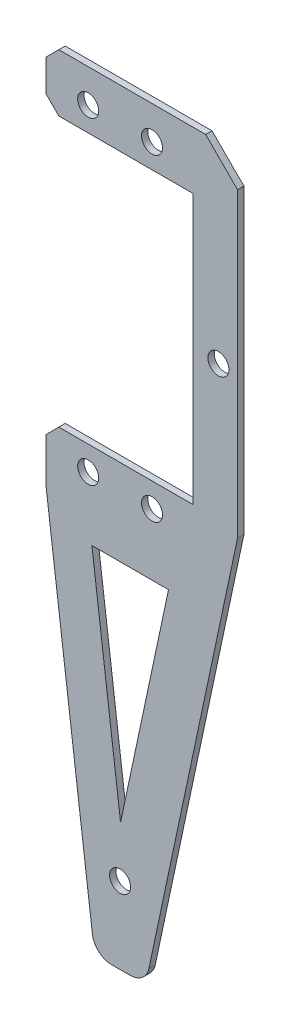
ISO-10303-21;
HEADER;
FILE_DESCRIPTION(('STEP AP214'),'2;1');
FILE_NAME('part.step','',(''),(''),'','','');
FILE_SCHEMA(('AUTOMOTIVE_DESIGN { 1 0 10303 214 1 1 1 1 }'));
ENDSEC;
DATA;
#1=APPLICATION_CONTEXT('core data for automotive mechanical design processes');
#2=APPLICATION_PROTOCOL_DEFINITION('international standard','automotive_design',2000,#1);
#3=PRODUCT_CONTEXT('',#1,'mechanical');
#4=PRODUCT('Part','Part','',(#3));
#5=PRODUCT_RELATED_PRODUCT_CATEGORY('part','',(#4));
#6=PRODUCT_DEFINITION_FORMATION('','',#4);
#7=PRODUCT_DEFINITION_CONTEXT('part definition',#1,'design');
#8=PRODUCT_DEFINITION('design','',#6,#7);
#9=PRODUCT_DEFINITION_SHAPE('','',#8);
#10=(LENGTH_UNIT() NAMED_UNIT(*) SI_UNIT(.MILLI.,.METRE.));
#11=(NAMED_UNIT(*) PLANE_ANGLE_UNIT() SI_UNIT($,.RADIAN.));
#12=(NAMED_UNIT(*) SI_UNIT($,.STERADIAN.) SOLID_ANGLE_UNIT());
#13=UNCERTAINTY_MEASURE_WITH_UNIT(LENGTH_MEASURE(1.E-05),#10,'distance_accuracy_value','');
#14=(GEOMETRIC_REPRESENTATION_CONTEXT(3) GLOBAL_UNCERTAINTY_ASSIGNED_CONTEXT((#13)) GLOBAL_UNIT_ASSIGNED_CONTEXT((#10,
#11,#12)) REPRESENTATION_CONTEXT('',''));
#15=CARTESIAN_POINT('',(0.,0.,0.));
#16=DIRECTION('',(0.,0.,1.));
#17=DIRECTION('',(1.,0.,0.));
#18=AXIS2_PLACEMENT_3D('',#15,#16,#17);
#19=CARTESIAN_POINT('',(-23.,-9.,-1.));
#20=DIRECTION('',(-1.,0.,0.));
#21=DIRECTION('',(0.,0.,1.));
#22=AXIS2_PLACEMENT_3D('',#19,#20,#21);
#23=PLANE('',#22);
#24=DIRECTION('',(0.,-1.,0.));
#25=VECTOR('',#24,1.);
#26=CARTESIAN_POINT('',(-23.,-9.,0.));
#27=LINE('',#26,#25);
#28=CARTESIAN_POINT('',(-23.,-2.00000000000003,0.));
#29=VERTEX_POINT('',#28);
#30=CARTESIAN_POINT('',(-23.,-9.,0.));
#31=VERTEX_POINT('',#30);
#32=EDGE_CURVE('E205',#29,#31,#27,.T.);
#33=ORIENTED_EDGE('',*,*,#32,.F.);
#34=DIRECTION('',(0.,0.,-1.));
#35=VECTOR('',#34,1.);
#36=CARTESIAN_POINT('',(-23.,-2.00000000000003,-1.));
#37=LINE('',#36,#35);
#38=CARTESIAN_POINT('',(-23.,-2.00000000000003,-1.));
#39=VERTEX_POINT('',#38);
#40=EDGE_CURVE('E305',#29,#39,#37,.T.);
#41=ORIENTED_EDGE('',*,*,#40,.T.);
#42=DIRECTION('',(0.,-1.,0.));
#43=VECTOR('',#42,1.);
#44=CARTESIAN_POINT('',(-23.,-9.,-1.));
#45=LINE('',#44,#43);
#46=CARTESIAN_POINT('',(-23.,-9.,-1.));
#47=VERTEX_POINT('',#46);
#48=EDGE_CURVE('E207',#39,#47,#45,.T.);
#49=ORIENTED_EDGE('',*,*,#48,.T.);
#50=DIRECTION('',(0.,0.,1.));
#51=VECTOR('',#50,1.);
#52=CARTESIAN_POINT('',(-23.,-9.,-1.));
#53=LINE('',#52,#51);
#54=EDGE_CURVE('E233',#47,#31,#53,.T.);
#55=ORIENTED_EDGE('',*,*,#54,.T.);
#56=EDGE_LOOP('',(#33,#41,#49,#55));
#57=FACE_BOUND('',#56,.T.);
#58=ADVANCED_FACE('F37',(#57),#23,.T.);
#59=CARTESIAN_POINT('',(-23.,0.,-1.));
#60=DIRECTION('',(0.,1.,0.));
#61=DIRECTION('',(0.,0.,1.));
#62=AXIS2_PLACEMENT_3D('',#59,#60,#61);
#63=PLANE('',#62);
#64=DIRECTION('',(-1.,0.,0.));
#65=VECTOR('',#64,1.);
#66=CARTESIAN_POINT('',(-23.,0.,-1.));
#67=LINE('',#66,#65);
#68=CARTESIAN_POINT('',(0.,0.,-1.));
#69=VERTEX_POINT('',#68);
#70=CARTESIAN_POINT('',(-21.,0.,-1.));
#71=VERTEX_POINT('',#70);
#72=EDGE_CURVE('E230',#69,#71,#67,.T.);
#73=ORIENTED_EDGE('',*,*,#72,.T.);
#74=DIRECTION('',(0.,0.,1.));
#75=VECTOR('',#74,1.);
#76=CARTESIAN_POINT('',(-21.,0.,-1.));
#77=LINE('',#76,#75);
#78=CARTESIAN_POINT('',(-21.,0.,0.));
#79=VERTEX_POINT('',#78);
#80=EDGE_CURVE('E296',#71,#79,#77,.T.);
#81=ORIENTED_EDGE('',*,*,#80,.T.);
#82=DIRECTION('',(-1.,0.,0.));
#83=VECTOR('',#82,1.);
#84=CARTESIAN_POINT('',(-23.,0.,0.));
#85=LINE('',#84,#83);
#86=CARTESIAN_POINT('',(0.,0.,0.));
#87=VERTEX_POINT('',#86);
#88=EDGE_CURVE('E210',#87,#79,#85,.T.);
#89=ORIENTED_EDGE('',*,*,#88,.F.);
#90=DIRECTION('',(0.,0.,1.));
#91=VECTOR('',#90,1.);
#92=CARTESIAN_POINT('',(0.,0.,-1.));
#93=LINE('',#92,#91);
#94=EDGE_CURVE('E259',#69,#87,#93,.T.);
#95=ORIENTED_EDGE('',*,*,#94,.F.);
#96=EDGE_LOOP('',(#73,#81,#89,#95));
#97=FACE_BOUND('',#96,.T.);
#98=ADVANCED_FACE('F378',(#97),#63,.T.);
#99=CARTESIAN_POINT('',(0.,0.,-1.));
#100=DIRECTION('',(-1.,0.,0.));
#101=DIRECTION('',(0.,0.,1.));
#102=AXIS2_PLACEMENT_3D('',#99,#100,#101);
#103=PLANE('',#102);
#104=DIRECTION('',(0.,-1.,0.));
#105=VECTOR('',#104,1.);
#106=CARTESIAN_POINT('',(0.,0.,0.));
#107=LINE('',#106,#105);
#108=CARTESIAN_POINT('',(0.,42.2,0.));
#109=VERTEX_POINT('',#108);
#110=EDGE_CURVE('E254',#109,#87,#107,.T.);
#111=ORIENTED_EDGE('',*,*,#110,.F.);
#112=DIRECTION('',(0.,0.,1.));
#113=VECTOR('',#112,1.);
#114=CARTESIAN_POINT('',(0.,42.2,-1.));
#115=LINE('',#114,#113);
#116=CARTESIAN_POINT('',(0.,42.2,-1.));
#117=VERTEX_POINT('',#116);
#118=EDGE_CURVE('E262',#117,#109,#115,.T.);
#119=ORIENTED_EDGE('',*,*,#118,.F.);
#120=DIRECTION('',(0.,-1.,0.));
#121=VECTOR('',#120,1.);
#122=CARTESIAN_POINT('',(0.,0.,-1.));
#123=LINE('',#122,#121);
#124=EDGE_CURVE('E227',#117,#69,#123,.T.);
#125=ORIENTED_EDGE('',*,*,#124,.T.);
#126=ORIENTED_EDGE('',*,*,#94,.T.);
#127=EDGE_LOOP('',(#111,#119,#125,#126));
#128=FACE_BOUND('',#127,.T.);
#129=ADVANCED_FACE('F382',(#128),#103,.T.);
#130=CARTESIAN_POINT('',(0.,42.2,-1.));
#131=DIRECTION('',(0.,-1.,0.));
#132=DIRECTION('',(0.,0.,-1.));
#133=AXIS2_PLACEMENT_3D('',#130,#131,#132);
#134=PLANE('',#133);
#135=DIRECTION('',(1.,0.,0.));
#136=VECTOR('',#135,1.);
#137=CARTESIAN_POINT('',(0.,42.2,0.));
#138=LINE('',#137,#136);
#139=CARTESIAN_POINT('',(-21.,42.2,0.));
#140=VERTEX_POINT('',#139);
#141=EDGE_CURVE('E252',#140,#109,#138,.T.);
#142=ORIENTED_EDGE('',*,*,#141,.F.);
#143=DIRECTION('',(0.,0.,-1.));
#144=VECTOR('',#143,1.);
#145=CARTESIAN_POINT('',(-21.,42.2,-1.));
#146=LINE('',#145,#144);
#147=CARTESIAN_POINT('',(-21.,42.2,-1.));
#148=VERTEX_POINT('',#147);
#149=EDGE_CURVE('E45',#140,#148,#146,.T.);
#150=ORIENTED_EDGE('',*,*,#149,.T.);
#151=DIRECTION('',(1.,0.,0.));
#152=VECTOR('',#151,1.);
#153=CARTESIAN_POINT('',(0.,42.2,-1.));
#154=LINE('',#153,#152);
#155=EDGE_CURVE('E225',#148,#117,#154,.T.);
#156=ORIENTED_EDGE('',*,*,#155,.T.);
#157=ORIENTED_EDGE('',*,*,#118,.T.);
#158=EDGE_LOOP('',(#142,#150,#156,#157));
#159=FACE_BOUND('',#158,.T.);
#160=ADVANCED_FACE('F318',(#159),#134,.T.);
#161=CARTESIAN_POINT('',(-23.,42.2,-1.));
#162=DIRECTION('',(-1.,0.,0.));
#163=DIRECTION('',(0.,-1.,0.));
#164=AXIS2_PLACEMENT_3D('',#161,#162,#163);
#165=PLANE('',#164);
#166=DIRECTION('',(0.,-1.,0.));
#167=VECTOR('',#166,1.);
#168=CARTESIAN_POINT('',(-23.,42.2,-1.));
#169=LINE('',#168,#167);
#170=CARTESIAN_POINT('',(-23.,49.2,-1.));
#171=VERTEX_POINT('',#170);
#172=CARTESIAN_POINT('',(-23.,44.2,-1.));
#173=VERTEX_POINT('',#172);
#174=EDGE_CURVE('E223',#171,#173,#169,.T.);
#175=ORIENTED_EDGE('',*,*,#174,.T.);
#176=DIRECTION('',(0.,0.,1.));
#177=VECTOR('',#176,1.);
#178=CARTESIAN_POINT('',(-23.,44.2,-1.));
#179=LINE('',#178,#177);
#180=CARTESIAN_POINT('',(-23.,44.2,0.));
#181=VERTEX_POINT('',#180);
#182=EDGE_CURVE('E313',#173,#181,#179,.T.);
#183=ORIENTED_EDGE('',*,*,#182,.T.);
#184=DIRECTION('',(0.,-1.,0.));
#185=VECTOR('',#184,1.);
#186=CARTESIAN_POINT('',(-23.,42.2,0.));
#187=LINE('',#186,#185);
#188=CARTESIAN_POINT('',(-23.,49.2,0.));
#189=VERTEX_POINT('',#188);
#190=EDGE_CURVE('E249',#189,#181,#187,.T.);
#191=ORIENTED_EDGE('',*,*,#190,.F.);
#192=DIRECTION('',(0.,0.,-1.));
#193=VECTOR('',#192,1.);
#194=CARTESIAN_POINT('',(-23.,49.2,-1.));
#195=LINE('',#194,#193);
#196=EDGE_CURVE('E311',#189,#171,#195,.T.);
#197=ORIENTED_EDGE('',*,*,#196,.T.);
#198=EDGE_LOOP('',(#175,#183,#191,#197));
#199=FACE_BOUND('',#198,.T.);
#200=ADVANCED_FACE('F328',(#199),#165,.T.);
#201=CARTESIAN_POINT('',(-23.,51.2,-1.));
#202=DIRECTION('',(0.,1.,0.));
#203=DIRECTION('',(0.,0.,1.));
#204=AXIS2_PLACEMENT_3D('',#201,#202,#203);
#205=PLANE('',#204);
#206=DIRECTION('',(-1.,0.,0.));
#207=VECTOR('',#206,1.);
#208=CARTESIAN_POINT('',(-23.,51.2,-1.));
#209=LINE('',#208,#207);
#210=CARTESIAN_POINT('',(1.99999999999998,51.2,-1.));
#211=VERTEX_POINT('',#210);
#212=CARTESIAN_POINT('',(-21.,51.2,-1.));
#213=VERTEX_POINT('',#212);
#214=EDGE_CURVE('E221',#211,#213,#209,.T.);
#215=ORIENTED_EDGE('',*,*,#214,.T.);
#216=DIRECTION('',(0.,0.,1.));
#217=VECTOR('',#216,1.);
#218=CARTESIAN_POINT('',(-21.,51.2,-1.));
#219=LINE('',#218,#217);
#220=CARTESIAN_POINT('',(-21.,51.2,0.));
#221=VERTEX_POINT('',#220);
#222=EDGE_CURVE('E11',#213,#221,#219,.T.);
#223=ORIENTED_EDGE('',*,*,#222,.T.);
#224=DIRECTION('',(-1.,0.,0.));
#225=VECTOR('',#224,1.);
#226=CARTESIAN_POINT('',(-23.,51.2,0.));
#227=LINE('',#226,#225);
#228=CARTESIAN_POINT('',(1.99999999999998,51.2,0.));
#229=VERTEX_POINT('',#228);
#230=EDGE_CURVE('E246',#229,#221,#227,.T.);
#231=ORIENTED_EDGE('',*,*,#230,.F.);
#232=DIRECTION('',(0.,0.,-1.));
#233=VECTOR('',#232,1.);
#234=CARTESIAN_POINT('',(1.99999999999998,51.2,-1.));
#235=LINE('',#234,#233);
#236=EDGE_CURVE('E274',#229,#211,#235,.T.);
#237=ORIENTED_EDGE('',*,*,#236,.T.);
#238=EDGE_LOOP('',(#215,#223,#231,#237));
#239=FACE_BOUND('',#238,.T.);
#240=ADVANCED_FACE('F336',(#239),#205,.T.);
#241=CARTESIAN_POINT('',(7.,51.2,-1.));
#242=DIRECTION('',(1.,0.,0.));
#243=DIRECTION('',(0.,1.,0.));
#244=AXIS2_PLACEMENT_3D('',#241,#242,#243);
#245=PLANE('',#244);
#246=DIRECTION('',(0.,1.,0.));
#247=VECTOR('',#246,1.);
#248=CARTESIAN_POINT('',(7.,51.2,-1.));
#249=LINE('',#248,#247);
#250=CARTESIAN_POINT('',(7.00000000000001,-1.053326423508,-1.));
#251=VERTEX_POINT('',#250);
#252=CARTESIAN_POINT('',(7.,46.2,-1.));
#253=VERTEX_POINT('',#252);
#254=EDGE_CURVE('E218',#251,#253,#249,.T.);
#255=ORIENTED_EDGE('',*,*,#254,.T.);
#256=DIRECTION('',(0.,0.,1.));
#257=VECTOR('',#256,1.);
#258=CARTESIAN_POINT('',(7.,46.2,-1.));
#259=LINE('',#258,#257);
#260=CARTESIAN_POINT('',(7.,46.2,0.));
#261=VERTEX_POINT('',#260);
#262=EDGE_CURVE('E261',#253,#261,#259,.T.);
#263=ORIENTED_EDGE('',*,*,#262,.T.);
#264=DIRECTION('',(0.,1.,0.));
#265=VECTOR('',#264,1.);
#266=CARTESIAN_POINT('',(7.,51.2,0.));
#267=LINE('',#266,#265);
#268=CARTESIAN_POINT('',(7.00000000000001,-1.053326423508,0.));
#269=VERTEX_POINT('',#268);
#270=EDGE_CURVE('E243',#269,#261,#267,.T.);
#271=ORIENTED_EDGE('',*,*,#270,.F.);
#272=DIRECTION('',(0.,0.,1.));
#273=VECTOR('',#272,1.);
#274=CARTESIAN_POINT('',(7.00000000000001,-1.053326423508,-1.));
#275=LINE('',#274,#273);
#276=EDGE_CURVE('E265',#251,#269,#275,.T.);
#277=ORIENTED_EDGE('',*,*,#276,.F.);
#278=EDGE_LOOP('',(#255,#263,#271,#277));
#279=FACE_BOUND('',#278,.T.);
#280=ADVANCED_FACE('F345',(#279),#245,.T.);
#281=CARTESIAN_POINT('',(-7.40000000000026,-68.8,-1.));
#282=DIRECTION('',(0.978147600733806,-0.207911690817756,0.));
#283=DIRECTION('',(0.207911690817756,0.978147600733806,0.));
#284=AXIS2_PLACEMENT_3D('',#281,#282,#283);
#285=PLANE('',#284);
#286=DIRECTION('',(0.207911690817756,0.978147600733806,0.));
#287=VECTOR('',#286,1.);
#288=CARTESIAN_POINT('',(-7.40000000000026,-68.8,0.));
#289=LINE('',#288,#287);
#290=CARTESIAN_POINT('',(-6.89490929738386,-66.4237350724533,0.));
#291=VERTEX_POINT('',#290);
#292=EDGE_CURVE('E241',#291,#269,#289,.T.);
#293=ORIENTED_EDGE('',*,*,#292,.F.);
#294=DIRECTION('',(0.,0.,1.));
#295=VECTOR('',#294,1.);
#296=CARTESIAN_POINT('',(-6.89490929738386,-66.4237350724533,-1.));
#297=LINE('',#296,#295);
#298=CARTESIAN_POINT('',(-6.89490929738386,-66.4237350724533,-1.));
#299=VERTEX_POINT('',#298);
#300=EDGE_CURVE('E287',#291,#299,#297,.F.);
#301=ORIENTED_EDGE('',*,*,#300,.T.);
#302=DIRECTION('',(0.207911690817756,0.978147600733806,0.));
#303=VECTOR('',#302,1.);
#304=CARTESIAN_POINT('',(-7.40000000000026,-68.8,-1.));
#305=LINE('',#304,#303);
#306=EDGE_CURVE('E216',#299,#251,#305,.T.);
#307=ORIENTED_EDGE('',*,*,#306,.T.);
#308=ORIENTED_EDGE('',*,*,#276,.T.);
#309=EDGE_LOOP('',(#293,#301,#307,#308));
#310=FACE_BOUND('',#309,.T.);
#311=ADVANCED_FACE('F350',(#310),#285,.T.);
#312=CARTESIAN_POINT('',(-15.4000000000003,-68.8,-1.));
#313=DIRECTION('',(0.,-1.,0.));
#314=DIRECTION('',(0.,0.,-1.));
#315=AXIS2_PLACEMENT_3D('',#312,#313,#314);
#316=PLANE('',#315);
#317=DIRECTION('',(1.,0.,0.));
#318=VECTOR('',#317,1.);
#319=CARTESIAN_POINT('',(-15.4000000000003,-68.8,-1.));
#320=LINE('',#319,#318);
#321=CARTESIAN_POINT('',(-12.7571400358879,-68.8,-1.));
#322=VERTEX_POINT('',#321);
#323=CARTESIAN_POINT('',(-9.82935209958528,-68.8,-1.));
#324=VERTEX_POINT('',#323);
#325=EDGE_CURVE('E213',#322,#324,#320,.T.);
#326=ORIENTED_EDGE('',*,*,#325,.T.);
#327=DIRECTION('',(0.,0.,1.));
#328=VECTOR('',#327,1.);
#329=CARTESIAN_POINT('',(-9.82935209958528,-68.8,-1.));
#330=LINE('',#329,#328);
#331=CARTESIAN_POINT('',(-9.82935209958528,-68.8,0.));
#332=VERTEX_POINT('',#331);
#333=EDGE_CURVE('E280',#324,#332,#330,.T.);
#334=ORIENTED_EDGE('',*,*,#333,.T.);
#335=DIRECTION('',(1.,0.,0.));
#336=VECTOR('',#335,1.);
#337=CARTESIAN_POINT('',(-15.4000000000003,-68.8,0.));
#338=LINE('',#337,#336);
#339=CARTESIAN_POINT('',(-12.7571400358879,-68.8,0.));
#340=VERTEX_POINT('',#339);
#341=EDGE_CURVE('E238',#340,#332,#338,.T.);
#342=ORIENTED_EDGE('',*,*,#341,.F.);
#343=DIRECTION('',(0.,0.,1.));
#344=VECTOR('',#343,1.);
#345=CARTESIAN_POINT('',(-12.7571400358879,-68.8,-1.));
#346=LINE('',#345,#344);
#347=EDGE_CURVE('E278',#340,#322,#346,.F.);
#348=ORIENTED_EDGE('',*,*,#347,.T.);
#349=EDGE_LOOP('',(#326,#334,#342,#348));
#350=FACE_BOUND('',#349,.T.);
#351=ADVANCED_FACE('F359',(#350),#316,.T.);
#352=CARTESIAN_POINT('',(-23.,-9.,-1.));
#353=DIRECTION('',(-0.992020561218207,-0.126076191726724,0.));
#354=DIRECTION('',(0.126076191726724,-0.992020561218207,0.));
#355=AXIS2_PLACEMENT_3D('',#352,#353,#354);
#356=PLANE('',#355);
#357=DIRECTION('',(0.126076191726724,-0.992020561218207,0.));
#358=VECTOR('',#357,1.);
#359=CARTESIAN_POINT('',(-23.,-9.,-1.));
#360=LINE('',#359,#358);
#361=CARTESIAN_POINT('',(-15.7332017195426,-66.1782285751802,-1.));
#362=VERTEX_POINT('',#361);
#363=EDGE_CURVE('E209',#47,#362,#360,.T.);
#364=ORIENTED_EDGE('',*,*,#363,.T.);
#365=DIRECTION('',(0.,0.,1.));
#366=VECTOR('',#365,1.);
#367=CARTESIAN_POINT('',(-15.7332017195426,-66.1782285751802,-1.));
#368=LINE('',#367,#366);
#369=CARTESIAN_POINT('',(-15.7332017195426,-66.1782285751802,0.));
#370=VERTEX_POINT('',#369);
#371=EDGE_CURVE('E293',#362,#370,#368,.T.);
#372=ORIENTED_EDGE('',*,*,#371,.T.);
#373=DIRECTION('',(0.126076191726724,-0.992020561218207,0.));
#374=VECTOR('',#373,1.);
#375=CARTESIAN_POINT('',(-23.,-9.,0.));
#376=LINE('',#375,#374);
#377=EDGE_CURVE('E235',#31,#370,#376,.T.);
#378=ORIENTED_EDGE('',*,*,#377,.F.);
#379=ORIENTED_EDGE('',*,*,#54,.F.);
#380=EDGE_LOOP('',(#364,#372,#378,#379));
#381=FACE_BOUND('',#380,.T.);
#382=ADVANCED_FACE('F367',(#381),#356,.T.);
#383=CARTESIAN_POINT('',(0.,0.,-1.));
#384=DIRECTION('',(0.,0.,-1.));
#385=DIRECTION('',(-1.,0.,0.));
#386=AXIS2_PLACEMENT_3D('',#383,#384,#385);
#387=PLANE('',#386);
#388=CARTESIAN_POINT('',(-6.4,46.,-1.));
#389=DIRECTION('',(0.,0.,1.));
#390=DIRECTION('',(1.,0.,0.));
#391=AXIS2_PLACEMENT_3D('',#388,#389,#390);
#392=CIRCLE('',#391,1.65);
#393=CARTESIAN_POINT('',(-4.75,46.,-1.));
#394=VERTEX_POINT('',#393);
#395=EDGE_CURVE('E677',#394,#394,#392,.T.);
#396=ORIENTED_EDGE('',*,*,#395,.T.);
#397=EDGE_LOOP('',(#396));
#398=FACE_BOUND('',#397,.T.);
#399=CARTESIAN_POINT('',(-16.4,46.,-1.));
#400=DIRECTION('',(0.,0.,1.));
#401=DIRECTION('',(1.,0.,0.));
#402=AXIS2_PLACEMENT_3D('',#399,#400,#401);
#403=CIRCLE('',#402,1.65);
#404=CARTESIAN_POINT('',(-14.75,46.,-1.));
#405=VERTEX_POINT('',#404);
#406=EDGE_CURVE('E671',#405,#405,#403,.T.);
#407=ORIENTED_EDGE('',*,*,#406,.T.);
#408=EDGE_LOOP('',(#407));
#409=FACE_BOUND('',#408,.T.);
#410=CARTESIAN_POINT('',(-16.4,-3.79999999999999,-1.));
#411=DIRECTION('',(0.,0.,1.));
#412=DIRECTION('',(1.,0.,0.));
#413=AXIS2_PLACEMENT_3D('',#410,#411,#412);
#414=CIRCLE('',#413,1.65);
#415=CARTESIAN_POINT('',(-14.75,-3.79999999999999,-1.));
#416=VERTEX_POINT('',#415);
#417=EDGE_CURVE('E665',#416,#416,#414,.T.);
#418=ORIENTED_EDGE('',*,*,#417,.T.);
#419=EDGE_LOOP('',(#418));
#420=FACE_BOUND('',#419,.T.);
#421=CARTESIAN_POINT('',(-6.40000000000001,-3.8,-1.));
#422=DIRECTION('',(0.,0.,1.));
#423=DIRECTION('',(1.,0.,0.));
#424=AXIS2_PLACEMENT_3D('',#421,#422,#423);
#425=CIRCLE('',#424,1.65);
#426=CARTESIAN_POINT('',(-4.75000000000001,-3.8,-1.));
#427=VERTEX_POINT('',#426);
#428=EDGE_CURVE('E659',#427,#427,#425,.T.);
#429=ORIENTED_EDGE('',*,*,#428,.T.);
#430=EDGE_LOOP('',(#429));
#431=FACE_BOUND('',#430,.T.);
#432=CARTESIAN_POINT('',(4.00000000000001,21.1,-1.));
#433=DIRECTION('',(0.,0.,1.));
#434=DIRECTION('',(1.,0.,0.));
#435=AXIS2_PLACEMENT_3D('',#432,#433,#434);
#436=CIRCLE('',#435,1.65);
#437=CARTESIAN_POINT('',(5.65,21.1,-1.));
#438=VERTEX_POINT('',#437);
#439=EDGE_CURVE('E652',#438,#438,#436,.T.);
#440=ORIENTED_EDGE('',*,*,#439,.T.);
#441=EDGE_LOOP('',(#440));
#442=FACE_BOUND('',#441,.T.);
#443=CARTESIAN_POINT('',(-11.4000000000003,-56.8,-1.));
#444=DIRECTION('',(0.,0.,1.));
#445=DIRECTION('',(1.,0.,0.));
#446=AXIS2_PLACEMENT_3D('',#443,#444,#445);
#447=CIRCLE('',#446,1.65);
#448=CARTESIAN_POINT('',(-9.75000000000026,-56.8,-1.));
#449=VERTEX_POINT('',#448);
#450=EDGE_CURVE('E197',#449,#449,#447,.T.);
#451=ORIENTED_EDGE('',*,*,#450,.T.);
#452=EDGE_LOOP('',(#451));
#453=FACE_BOUND('',#452,.T.);
#454=DIRECTION('',(0.126076191726725,-0.992020561218207,0.));
#455=VECTOR('',#454,1.);
#456=CARTESIAN_POINT('',(-11.3275935255201,-48.8,-1.));
#457=LINE('',#456,#455);
#458=CARTESIAN_POINT('',(-15.8177972625314,-13.4691863850941,-1.));
#459=VERTEX_POINT('',#458);
#460=CARTESIAN_POINT('',(-11.3275935255201,-48.8,-1.));
#461=VERTEX_POINT('',#460);
#462=EDGE_CURVE('E174',#459,#461,#457,.T.);
#463=ORIENTED_EDGE('',*,*,#462,.T.);
#464=DIRECTION('',(0.207911690817756,0.978147600733806,0.));
#465=VECTOR('',#464,1.);
#466=CARTESIAN_POINT('',(-3.81779726253143,-13.469186385094,-1.));
#467=LINE('',#466,#465);
#468=CARTESIAN_POINT('',(-3.81779726253143,-13.469186385094,-1.));
#469=VERTEX_POINT('',#468);
#470=EDGE_CURVE('E186',#461,#469,#467,.T.);
#471=ORIENTED_EDGE('',*,*,#470,.T.);
#472=DIRECTION('',(-1.,0.,0.));
#473=VECTOR('',#472,1.);
#474=CARTESIAN_POINT('',(-15.8177972625314,-13.4691863850941,-1.));
#475=LINE('',#474,#473);
#476=EDGE_CURVE('E182',#469,#459,#475,.T.);
#477=ORIENTED_EDGE('',*,*,#476,.T.);
#478=EDGE_LOOP('',(#463,#471,#477));
#479=FACE_BOUND('',#478,.T.);
#480=ORIENTED_EDGE('',*,*,#48,.F.);
#481=DIRECTION('',(-0.707106781186543,-0.707106781186552,0.));
#482=VECTOR('',#481,1.);
#483=CARTESIAN_POINT('',(-10.5000000000001,10.5,-1.));
#484=LINE('',#483,#482);
#485=EDGE_CURVE('E309',#39,#71,#484,.F.);
#486=ORIENTED_EDGE('',*,*,#485,.T.);
#487=ORIENTED_EDGE('',*,*,#72,.F.);
#488=ORIENTED_EDGE('',*,*,#124,.F.);
#489=ORIENTED_EDGE('',*,*,#155,.F.);
#490=DIRECTION('',(0.707106781186552,-0.707106781186543,0.));
#491=VECTOR('',#490,1.);
#492=CARTESIAN_POINT('',(10.6000000000002,10.6000000000003,-1.));
#493=LINE('',#492,#491);
#494=EDGE_CURVE('E58',#148,#173,#493,.F.);
#495=ORIENTED_EDGE('',*,*,#494,.T.);
#496=ORIENTED_EDGE('',*,*,#174,.F.);
#497=DIRECTION('',(-0.707106781186543,-0.707106781186552,0.));
#498=VECTOR('',#497,1.);
#499=CARTESIAN_POINT('',(-36.1000000000002,36.0999999999996,-1.));
#500=LINE('',#499,#498);
#501=EDGE_CURVE('E52',#171,#213,#500,.F.);
#502=ORIENTED_EDGE('',*,*,#501,.T.);
#503=ORIENTED_EDGE('',*,*,#214,.F.);
#504=DIRECTION('',(-0.70710678118655,0.707106781186545,0.));
#505=VECTOR('',#504,1.);
#506=CARTESIAN_POINT('',(26.6,26.6000000000001,-1.));
#507=LINE('',#506,#505);
#508=EDGE_CURVE('E276',#211,#253,#507,.F.);
#509=ORIENTED_EDGE('',*,*,#508,.T.);
#510=ORIENTED_EDGE('',*,*,#254,.F.);
#511=ORIENTED_EDGE('',*,*,#306,.F.);
#512=CARTESIAN_POINT('',(-9.82935209958528,-65.8,-1.));
#513=DIRECTION('',(0.,0.,-1.));
#514=DIRECTION('',(-1.,0.,0.));
#515=AXIS2_PLACEMENT_3D('',#512,#513,#514);
#516=CIRCLE('',#515,3.);
#517=EDGE_CURVE('E291',#299,#324,#516,.T.);
#518=ORIENTED_EDGE('',*,*,#517,.T.);
#519=ORIENTED_EDGE('',*,*,#325,.F.);
#520=CARTESIAN_POINT('',(-12.7571400358879,-65.8,-1.));
#521=DIRECTION('',(0.,0.,-1.));
#522=DIRECTION('',(-1.,0.,0.));
#523=AXIS2_PLACEMENT_3D('',#520,#521,#522);
#524=CIRCLE('',#523,3.);
#525=EDGE_CURVE('E289',#322,#362,#524,.T.);
#526=ORIENTED_EDGE('',*,*,#525,.T.);
#527=ORIENTED_EDGE('',*,*,#363,.F.);
#528=EDGE_LOOP('',(#480,#486,#487,#488,#489,#495,#496,#502,#503,#509,#510,#511,#518,#519,#526,#527));
#529=FACE_BOUND('',#528,.T.);
#530=ADVANCED_FACE('F190',(#398,#409,#420,#431,#442,#453,#479,#529),#387,.T.);
#531=CARTESIAN_POINT('',(0.,0.,0.));
#532=DIRECTION('',(0.,0.,-1.));
#533=DIRECTION('',(-1.,0.,0.));
#534=AXIS2_PLACEMENT_3D('',#531,#532,#533);
#535=PLANE('',#534);
#536=CARTESIAN_POINT('',(-6.4,46.,0.));
#537=DIRECTION('',(0.,0.,1.));
#538=DIRECTION('',(1.,0.,0.));
#539=AXIS2_PLACEMENT_3D('',#536,#537,#538);
#540=CIRCLE('',#539,1.65);
#541=CARTESIAN_POINT('',(-4.75,46.,0.));
#542=VERTEX_POINT('',#541);
#543=EDGE_CURVE('E680',#542,#542,#540,.T.);
#544=ORIENTED_EDGE('',*,*,#543,.F.);
#545=EDGE_LOOP('',(#544));
#546=FACE_BOUND('',#545,.T.);
#547=CARTESIAN_POINT('',(-16.4,46.,0.));
#548=DIRECTION('',(0.,0.,1.));
#549=DIRECTION('',(1.,0.,0.));
#550=AXIS2_PLACEMENT_3D('',#547,#548,#549);
#551=CIRCLE('',#550,1.65);
#552=CARTESIAN_POINT('',(-14.75,46.,0.));
#553=VERTEX_POINT('',#552);
#554=EDGE_CURVE('E674',#553,#553,#551,.T.);
#555=ORIENTED_EDGE('',*,*,#554,.F.);
#556=EDGE_LOOP('',(#555));
#557=FACE_BOUND('',#556,.T.);
#558=CARTESIAN_POINT('',(-16.4,-3.79999999999999,0.));
#559=DIRECTION('',(0.,0.,1.));
#560=DIRECTION('',(1.,0.,0.));
#561=AXIS2_PLACEMENT_3D('',#558,#559,#560);
#562=CIRCLE('',#561,1.65);
#563=CARTESIAN_POINT('',(-14.75,-3.79999999999999,0.));
#564=VERTEX_POINT('',#563);
#565=EDGE_CURVE('E668',#564,#564,#562,.T.);
#566=ORIENTED_EDGE('',*,*,#565,.F.);
#567=EDGE_LOOP('',(#566));
#568=FACE_BOUND('',#567,.T.);
#569=CARTESIAN_POINT('',(-6.40000000000001,-3.8,0.));
#570=DIRECTION('',(0.,0.,1.));
#571=DIRECTION('',(1.,0.,0.));
#572=AXIS2_PLACEMENT_3D('',#569,#570,#571);
#573=CIRCLE('',#572,1.65);
#574=CARTESIAN_POINT('',(-4.75000000000001,-3.8,0.));
#575=VERTEX_POINT('',#574);
#576=EDGE_CURVE('E662',#575,#575,#573,.T.);
#577=ORIENTED_EDGE('',*,*,#576,.F.);
#578=EDGE_LOOP('',(#577));
#579=FACE_BOUND('',#578,.T.);
#580=CARTESIAN_POINT('',(4.00000000000001,21.1,0.));
#581=DIRECTION('',(0.,0.,1.));
#582=DIRECTION('',(1.,0.,0.));
#583=AXIS2_PLACEMENT_3D('',#580,#581,#582);
#584=CIRCLE('',#583,1.65);
#585=CARTESIAN_POINT('',(5.65,21.1,0.));
#586=VERTEX_POINT('',#585);
#587=EDGE_CURVE('E654',#586,#586,#584,.T.);
#588=ORIENTED_EDGE('',*,*,#587,.F.);
#589=EDGE_LOOP('',(#588));
#590=FACE_BOUND('',#589,.T.);
#591=CARTESIAN_POINT('',(-11.4000000000003,-56.8,0.));
#592=DIRECTION('',(0.,0.,1.));
#593=DIRECTION('',(1.,0.,0.));
#594=AXIS2_PLACEMENT_3D('',#591,#592,#593);
#595=CIRCLE('',#594,1.65);
#596=CARTESIAN_POINT('',(-9.75000000000026,-56.8,0.));
#597=VERTEX_POINT('',#596);
#598=EDGE_CURVE('E650',#597,#597,#595,.T.);
#599=ORIENTED_EDGE('',*,*,#598,.F.);
#600=EDGE_LOOP('',(#599));
#601=FACE_BOUND('',#600,.T.);
#602=DIRECTION('',(0.207911690817756,0.978147600733806,0.));
#603=VECTOR('',#602,1.);
#604=CARTESIAN_POINT('',(-3.81779726253143,-13.469186385094,0.));
#605=LINE('',#604,#603);
#606=CARTESIAN_POINT('',(-11.3275935255201,-48.8,0.));
#607=VERTEX_POINT('',#606);
#608=CARTESIAN_POINT('',(-3.81779726253143,-13.469186385094,0.));
#609=VERTEX_POINT('',#608);
#610=EDGE_CURVE('E194',#607,#609,#605,.T.);
#611=ORIENTED_EDGE('',*,*,#610,.F.);
#612=DIRECTION('',(0.126076191726725,-0.992020561218207,0.));
#613=VECTOR('',#612,1.);
#614=CARTESIAN_POINT('',(-11.3275935255201,-48.8,0.));
#615=LINE('',#614,#613);
#616=CARTESIAN_POINT('',(-15.8177972625314,-13.4691863850941,0.));
#617=VERTEX_POINT('',#616);
#618=EDGE_CURVE('E177',#617,#607,#615,.T.);
#619=ORIENTED_EDGE('',*,*,#618,.F.);
#620=DIRECTION('',(-1.,0.,0.));
#621=VECTOR('',#620,1.);
#622=CARTESIAN_POINT('',(-15.8177972625314,-13.4691863850941,0.));
#623=LINE('',#622,#621);
#624=EDGE_CURVE('E191',#609,#617,#623,.T.);
#625=ORIENTED_EDGE('',*,*,#624,.F.);
#626=EDGE_LOOP('',(#611,#619,#625));
#627=FACE_BOUND('',#626,.T.);
#628=ORIENTED_EDGE('',*,*,#88,.T.);
#629=DIRECTION('',(0.707106781186543,0.707106781186552,0.));
#630=VECTOR('',#629,1.);
#631=CARTESIAN_POINT('',(-21.,0.,0.));
#632=LINE('',#631,#630);
#633=EDGE_CURVE('E303',#79,#29,#632,.F.);
#634=ORIENTED_EDGE('',*,*,#633,.T.);
#635=ORIENTED_EDGE('',*,*,#32,.T.);
#636=ORIENTED_EDGE('',*,*,#377,.T.);
#637=CARTESIAN_POINT('',(-12.7571400358879,-65.8,0.));
#638=DIRECTION('',(0.,0.,-1.));
#639=DIRECTION('',(-1.,0.,0.));
#640=AXIS2_PLACEMENT_3D('',#637,#638,#639);
#641=CIRCLE('',#640,3.);
#642=EDGE_CURVE('E283',#370,#340,#641,.F.);
#643=ORIENTED_EDGE('',*,*,#642,.T.);
#644=ORIENTED_EDGE('',*,*,#341,.T.);
#645=CARTESIAN_POINT('',(-9.82935209958528,-65.8,0.));
#646=DIRECTION('',(0.,0.,-1.));
#647=DIRECTION('',(-1.,0.,0.));
#648=AXIS2_PLACEMENT_3D('',#645,#646,#647);
#649=CIRCLE('',#648,3.);
#650=EDGE_CURVE('E285',#332,#291,#649,.F.);
#651=ORIENTED_EDGE('',*,*,#650,.T.);
#652=ORIENTED_EDGE('',*,*,#292,.T.);
#653=ORIENTED_EDGE('',*,*,#270,.T.);
#654=DIRECTION('',(0.70710678118655,-0.707106781186545,0.));
#655=VECTOR('',#654,1.);
#656=CARTESIAN_POINT('',(7.,46.2,0.));
#657=LINE('',#656,#655);
#658=EDGE_CURVE('E272',#261,#229,#657,.F.);
#659=ORIENTED_EDGE('',*,*,#658,.T.);
#660=ORIENTED_EDGE('',*,*,#230,.T.);
#661=DIRECTION('',(0.707106781186543,0.707106781186552,0.));
#662=VECTOR('',#661,1.);
#663=CARTESIAN_POINT('',(-21.,51.2,0.));
#664=LINE('',#663,#662);
#665=EDGE_CURVE('E299',#221,#189,#664,.F.);
#666=ORIENTED_EDGE('',*,*,#665,.T.);
#667=ORIENTED_EDGE('',*,*,#190,.T.);
#668=DIRECTION('',(-0.707106781186552,0.707106781186543,0.));
#669=VECTOR('',#668,1.);
#670=CARTESIAN_POINT('',(-23.,44.2,0.));
#671=LINE('',#670,#669);
#672=EDGE_CURVE('E301',#181,#140,#671,.F.);
#673=ORIENTED_EDGE('',*,*,#672,.T.);
#674=ORIENTED_EDGE('',*,*,#141,.T.);
#675=ORIENTED_EDGE('',*,*,#110,.T.);
#676=EDGE_LOOP('',(#628,#634,#635,#636,#643,#644,#651,#652,#653,#659,#660,#666,#667,#673,#674,#675));
#677=FACE_BOUND('',#676,.T.);
#678=ADVANCED_FACE('F331',(#546,#557,#568,#579,#590,#601,#627,#677),#535,.F.);
#679=CARTESIAN_POINT('',(-11.3275935255201,-48.8,-1.));
#680=DIRECTION('',(-0.992020561218207,-0.126076191726725,0.));
#681=DIRECTION('',(0.126076191726725,-0.992020561218207,0.));
#682=AXIS2_PLACEMENT_3D('',#679,#680,#681);
#683=PLANE('',#682);
#684=ORIENTED_EDGE('',*,*,#618,.T.);
#685=DIRECTION('',(0.,0.,1.));
#686=VECTOR('',#685,1.);
#687=CARTESIAN_POINT('',(-11.3275935255201,-48.8,-1.));
#688=LINE('',#687,#686);
#689=EDGE_CURVE('E170',#461,#607,#688,.T.);
#690=ORIENTED_EDGE('',*,*,#689,.F.);
#691=ORIENTED_EDGE('',*,*,#462,.F.);
#692=DIRECTION('',(0.,0.,1.));
#693=VECTOR('',#692,1.);
#694=CARTESIAN_POINT('',(-15.8177972625314,-13.4691863850941,-1.));
#695=LINE('',#694,#693);
#696=EDGE_CURVE('E203',#459,#617,#695,.T.);
#697=ORIENTED_EDGE('',*,*,#696,.T.);
#698=EDGE_LOOP('',(#684,#690,#691,#697));
#699=FACE_BOUND('',#698,.T.);
#700=ADVANCED_FACE('F172',(#699),#683,.F.);
#701=CARTESIAN_POINT('',(-15.8177972625314,-13.4691863850941,-1.));
#702=DIRECTION('',(0.,1.,0.));
#703=DIRECTION('',(-1.,0.,0.));
#704=AXIS2_PLACEMENT_3D('',#701,#702,#703);
#705=PLANE('',#704);
#706=ORIENTED_EDGE('',*,*,#624,.T.);
#707=ORIENTED_EDGE('',*,*,#696,.F.);
#708=ORIENTED_EDGE('',*,*,#476,.F.);
#709=DIRECTION('',(0.,0.,1.));
#710=VECTOR('',#709,1.);
#711=CARTESIAN_POINT('',(-3.81779726253143,-13.469186385094,-1.));
#712=LINE('',#711,#710);
#713=EDGE_CURVE('E181',#469,#609,#712,.T.);
#714=ORIENTED_EDGE('',*,*,#713,.T.);
#715=EDGE_LOOP('',(#706,#707,#708,#714));
#716=FACE_BOUND('',#715,.T.);
#717=ADVANCED_FACE('F602',(#716),#705,.F.);
#718=CARTESIAN_POINT('',(-3.81779726253143,-13.469186385094,-1.));
#719=DIRECTION('',(0.978147600733806,-0.207911690817756,0.));
#720=DIRECTION('',(0.207911690817756,0.978147600733807,0.));
#721=AXIS2_PLACEMENT_3D('',#718,#719,#720);
#722=PLANE('',#721);
#723=ORIENTED_EDGE('',*,*,#610,.T.);
#724=ORIENTED_EDGE('',*,*,#713,.F.);
#725=ORIENTED_EDGE('',*,*,#470,.F.);
#726=ORIENTED_EDGE('',*,*,#689,.T.);
#727=EDGE_LOOP('',(#723,#724,#725,#726));
#728=FACE_BOUND('',#727,.T.);
#729=ADVANCED_FACE('F187',(#728),#722,.F.);
#730=CARTESIAN_POINT('',(-11.4000000000003,-56.8,0.));
#731=DIRECTION('',(0.,0.,1.));
#732=DIRECTION('',(1.,0.,0.));
#733=AXIS2_PLACEMENT_3D('',#730,#731,#732);
#734=CYLINDRICAL_SURFACE('',#733,1.65);
#735=ORIENTED_EDGE('',*,*,#450,.F.);
#736=EDGE_LOOP('',(#735));
#737=FACE_BOUND('',#736,.T.);
#738=ORIENTED_EDGE('',*,*,#598,.T.);
#739=EDGE_LOOP('',(#738));
#740=FACE_BOUND('',#739,.T.);
#741=ADVANCED_FACE('F583',(#737,#740),#734,.F.);
#742=CARTESIAN_POINT('',(4.00000000000001,21.1,0.));
#743=DIRECTION('',(0.,0.,1.));
#744=DIRECTION('',(1.,0.,0.));
#745=AXIS2_PLACEMENT_3D('',#742,#743,#744);
#746=CYLINDRICAL_SURFACE('',#745,1.65);
#747=ORIENTED_EDGE('',*,*,#439,.F.);
#748=EDGE_LOOP('',(#747));
#749=FACE_BOUND('',#748,.T.);
#750=ORIENTED_EDGE('',*,*,#587,.T.);
#751=EDGE_LOOP('',(#750));
#752=FACE_BOUND('',#751,.T.);
#753=ADVANCED_FACE('F573',(#749,#752),#746,.F.);
#754=CARTESIAN_POINT('',(-6.40000000000001,-3.8,0.));
#755=DIRECTION('',(0.,0.,1.));
#756=DIRECTION('',(1.,0.,0.));
#757=AXIS2_PLACEMENT_3D('',#754,#755,#756);
#758=CYLINDRICAL_SURFACE('',#757,1.65);
#759=ORIENTED_EDGE('',*,*,#428,.F.);
#760=EDGE_LOOP('',(#759));
#761=FACE_BOUND('',#760,.T.);
#762=ORIENTED_EDGE('',*,*,#576,.T.);
#763=EDGE_LOOP('',(#762));
#764=FACE_BOUND('',#763,.T.);
#765=ADVANCED_FACE('F563',(#761,#764),#758,.F.);
#766=CARTESIAN_POINT('',(-16.4,-3.79999999999999,0.));
#767=DIRECTION('',(0.,0.,1.));
#768=DIRECTION('',(1.,0.,0.));
#769=AXIS2_PLACEMENT_3D('',#766,#767,#768);
#770=CYLINDRICAL_SURFACE('',#769,1.65);
#771=ORIENTED_EDGE('',*,*,#417,.F.);
#772=EDGE_LOOP('',(#771));
#773=FACE_BOUND('',#772,.T.);
#774=ORIENTED_EDGE('',*,*,#565,.T.);
#775=EDGE_LOOP('',(#774));
#776=FACE_BOUND('',#775,.T.);
#777=ADVANCED_FACE('F553',(#773,#776),#770,.F.);
#778=CARTESIAN_POINT('',(-16.4,46.,0.));
#779=DIRECTION('',(0.,0.,1.));
#780=DIRECTION('',(1.,0.,0.));
#781=AXIS2_PLACEMENT_3D('',#778,#779,#780);
#782=CYLINDRICAL_SURFACE('',#781,1.65);
#783=ORIENTED_EDGE('',*,*,#406,.F.);
#784=EDGE_LOOP('',(#783));
#785=FACE_BOUND('',#784,.T.);
#786=ORIENTED_EDGE('',*,*,#554,.T.);
#787=EDGE_LOOP('',(#786));
#788=FACE_BOUND('',#787,.T.);
#789=ADVANCED_FACE('F543',(#785,#788),#782,.F.);
#790=CARTESIAN_POINT('',(-6.4,46.,0.));
#791=DIRECTION('',(0.,0.,1.));
#792=DIRECTION('',(1.,0.,0.));
#793=AXIS2_PLACEMENT_3D('',#790,#791,#792);
#794=CYLINDRICAL_SURFACE('',#793,1.65);
#795=ORIENTED_EDGE('',*,*,#395,.F.);
#796=EDGE_LOOP('',(#795));
#797=FACE_BOUND('',#796,.T.);
#798=ORIENTED_EDGE('',*,*,#543,.T.);
#799=EDGE_LOOP('',(#798));
#800=FACE_BOUND('',#799,.T.);
#801=ADVANCED_FACE('F400',(#797,#800),#794,.F.);
#802=CARTESIAN_POINT('',(7.,46.2,-1.));
#803=DIRECTION('',(-0.707106781186545,-0.70710678118655,0.));
#804=DIRECTION('',(0.,0.,1.));
#805=AXIS2_PLACEMENT_3D('',#802,#803,#804);
#806=PLANE('',#805);
#807=ORIENTED_EDGE('',*,*,#508,.F.);
#808=ORIENTED_EDGE('',*,*,#236,.F.);
#809=ORIENTED_EDGE('',*,*,#658,.F.);
#810=ORIENTED_EDGE('',*,*,#262,.F.);
#811=EDGE_LOOP('',(#807,#808,#809,#810));
#812=FACE_BOUND('',#811,.T.);
#813=ADVANCED_FACE('F342',(#812),#806,.F.);
#814=CARTESIAN_POINT('',(-9.82935209958528,-65.8,-1.));
#815=DIRECTION('',(0.,0.,1.));
#816=DIRECTION('',(1.,0.,0.));
#817=AXIS2_PLACEMENT_3D('',#814,#815,#816);
#818=CYLINDRICAL_SURFACE('',#817,3.);
#819=ORIENTED_EDGE('',*,*,#517,.F.);
#820=ORIENTED_EDGE('',*,*,#300,.F.);
#821=ORIENTED_EDGE('',*,*,#650,.F.);
#822=ORIENTED_EDGE('',*,*,#333,.F.);
#823=EDGE_LOOP('',(#819,#820,#821,#822));
#824=FACE_BOUND('',#823,.T.);
#825=ADVANCED_FACE('F356',(#824),#818,.T.);
#826=CARTESIAN_POINT('',(-12.7571400358879,-65.8,-1.));
#827=DIRECTION('',(0.,0.,1.));
#828=DIRECTION('',(1.,0.,0.));
#829=AXIS2_PLACEMENT_3D('',#826,#827,#828);
#830=CYLINDRICAL_SURFACE('',#829,3.);
#831=ORIENTED_EDGE('',*,*,#525,.F.);
#832=ORIENTED_EDGE('',*,*,#347,.F.);
#833=ORIENTED_EDGE('',*,*,#642,.F.);
#834=ORIENTED_EDGE('',*,*,#371,.F.);
#835=EDGE_LOOP('',(#831,#832,#833,#834));
#836=FACE_BOUND('',#835,.T.);
#837=ADVANCED_FACE('F365',(#836),#830,.T.);
#838=CARTESIAN_POINT('',(-21.,0.,-1.));
#839=DIRECTION('',(0.707106781186552,-0.707106781186542,0.));
#840=DIRECTION('',(0.,0.,1.));
#841=AXIS2_PLACEMENT_3D('',#838,#839,#840);
#842=PLANE('',#841);
#843=ORIENTED_EDGE('',*,*,#485,.F.);
#844=ORIENTED_EDGE('',*,*,#40,.F.);
#845=ORIENTED_EDGE('',*,*,#633,.F.);
#846=ORIENTED_EDGE('',*,*,#80,.F.);
#847=EDGE_LOOP('',(#843,#844,#845,#846));
#848=FACE_BOUND('',#847,.T.);
#849=ADVANCED_FACE('F375',(#848),#842,.F.);
#850=CARTESIAN_POINT('',(-23.,44.2,-1.));
#851=DIRECTION('',(0.707106781186542,0.707106781186552,0.));
#852=DIRECTION('',(0.,0.,1.));
#853=AXIS2_PLACEMENT_3D('',#850,#851,#852);
#854=PLANE('',#853);
#855=ORIENTED_EDGE('',*,*,#494,.F.);
#856=ORIENTED_EDGE('',*,*,#149,.F.);
#857=ORIENTED_EDGE('',*,*,#672,.F.);
#858=ORIENTED_EDGE('',*,*,#182,.F.);
#859=EDGE_LOOP('',(#855,#856,#857,#858));
#860=FACE_BOUND('',#859,.T.);
#861=ADVANCED_FACE('F325',(#860),#854,.F.);
#862=CARTESIAN_POINT('',(-21.,51.2,-1.));
#863=DIRECTION('',(0.707106781186552,-0.707106781186542,0.));
#864=DIRECTION('',(0.,0.,1.));
#865=AXIS2_PLACEMENT_3D('',#862,#863,#864);
#866=PLANE('',#865);
#867=ORIENTED_EDGE('',*,*,#501,.F.);
#868=ORIENTED_EDGE('',*,*,#196,.F.);
#869=ORIENTED_EDGE('',*,*,#665,.F.);
#870=ORIENTED_EDGE('',*,*,#222,.F.);
#871=EDGE_LOOP('',(#867,#868,#869,#870));
#872=FACE_BOUND('',#871,.T.);
#873=ADVANCED_FACE('F39',(#872),#866,.F.);
#874=CLOSED_SHELL('',(#58,#98,#129,#160,#200,#240,#280,#311,#351,#382,#530,#678,#700,#717,#729,
#741,#753,#765,#777,#789,#801,#813,#825,#837,#849,#861,#873));
#875=MANIFOLD_SOLID_BREP('B2',#874);
#876=ADVANCED_BREP_SHAPE_REPRESENTATION('',(#18,#875),#14);
#877=SHAPE_DEFINITION_REPRESENTATION(#9,#876);
ENDSEC;
END-ISO-10303-21;
